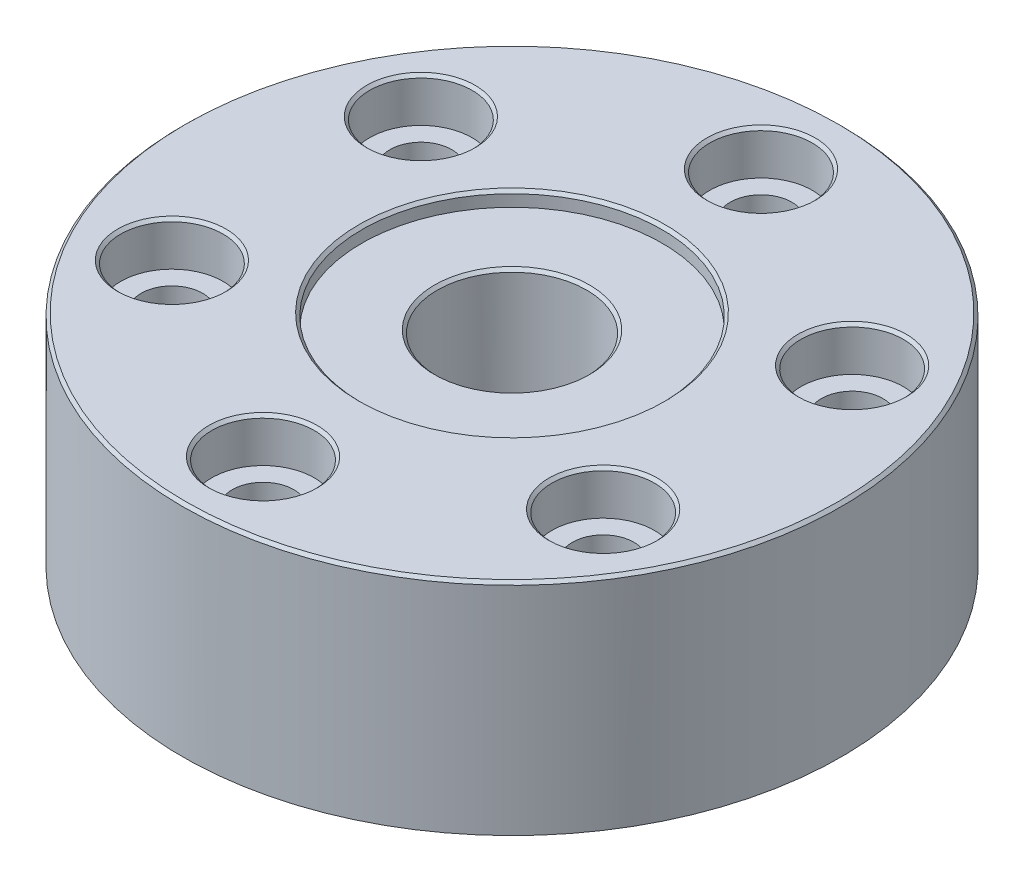
ISO-10303-21;
HEADER;
FILE_DESCRIPTION(('STEP AP214'),'2;1');
FILE_NAME('part.step','',(''),(''),'','','');
FILE_SCHEMA(('AUTOMOTIVE_DESIGN { 1 0 10303 214 1 1 1 1 }'));
ENDSEC;
DATA;
#1=APPLICATION_CONTEXT('core data for automotive mechanical design processes');
#2=APPLICATION_PROTOCOL_DEFINITION('international standard','automotive_design',2000,#1);
#3=PRODUCT_CONTEXT('',#1,'mechanical');
#4=PRODUCT('Part','Part','',(#3));
#5=PRODUCT_RELATED_PRODUCT_CATEGORY('part','',(#4));
#6=PRODUCT_DEFINITION_FORMATION('','',#4);
#7=PRODUCT_DEFINITION_CONTEXT('part definition',#1,'design');
#8=PRODUCT_DEFINITION('design','',#6,#7);
#9=PRODUCT_DEFINITION_SHAPE('','',#8);
#10=(LENGTH_UNIT() NAMED_UNIT(*) SI_UNIT(.MILLI.,.METRE.));
#11=(NAMED_UNIT(*) PLANE_ANGLE_UNIT() SI_UNIT($,.RADIAN.));
#12=(NAMED_UNIT(*) SI_UNIT($,.STERADIAN.) SOLID_ANGLE_UNIT());
#13=UNCERTAINTY_MEASURE_WITH_UNIT(LENGTH_MEASURE(1.E-05),#10,'distance_accuracy_value','');
#14=(GEOMETRIC_REPRESENTATION_CONTEXT(3) GLOBAL_UNCERTAINTY_ASSIGNED_CONTEXT((#13)) GLOBAL_UNIT_ASSIGNED_CONTEXT((#10,
#11,#12)) REPRESENTATION_CONTEXT('',''));
#15=CARTESIAN_POINT('',(0.,0.,0.));
#16=DIRECTION('',(0.,0.,1.));
#17=DIRECTION('',(1.,0.,0.));
#18=AXIS2_PLACEMENT_3D('',#15,#16,#17);
#19=CARTESIAN_POINT('',(0.,15.,0.));
#20=DIRECTION('',(0.,-1.,0.));
#21=DIRECTION('',(0.,0.,-1.));
#22=AXIS2_PLACEMENT_3D('',#19,#20,#21);
#23=CYLINDRICAL_SURFACE('',#22,22.5);
#24=CARTESIAN_POINT('',(0.,14.8,0.));
#25=DIRECTION('',(0.,1.,0.));
#26=DIRECTION('',(0.,0.,1.));
#27=AXIS2_PLACEMENT_3D('',#24,#25,#26);
#28=CIRCLE('',#27,22.5);
#29=CARTESIAN_POINT('',(0.,14.8,22.5));
#30=VERTEX_POINT('',#29);
#31=EDGE_CURVE('E10',#30,#30,#28,.F.);
#32=ORIENTED_EDGE('',*,*,#31,.T.);
#33=EDGE_LOOP('',(#32));
#34=FACE_BOUND('',#33,.T.);
#35=CARTESIAN_POINT('',(0.,0.,0.));
#36=DIRECTION('',(0.,-1.,0.));
#37=DIRECTION('',(0.,0.,-1.));
#38=AXIS2_PLACEMENT_3D('',#35,#36,#37);
#39=CIRCLE('',#38,22.5);
#40=CARTESIAN_POINT('',(0.,0.,-22.5));
#41=VERTEX_POINT('',#40);
#42=EDGE_CURVE('E127',#41,#41,#39,.T.);
#43=ORIENTED_EDGE('',*,*,#42,.F.);
#44=EDGE_LOOP('',(#43));
#45=FACE_BOUND('',#44,.T.);
#46=ADVANCED_FACE('F43',(#34,#45),#23,.T.);
#47=CARTESIAN_POINT('',(22.5,15.,0.));
#48=DIRECTION('',(0.,1.,0.));
#49=DIRECTION('',(0.,0.,1.));
#50=AXIS2_PLACEMENT_3D('',#47,#48,#49);
#51=PLANE('',#50);
#52=CARTESIAN_POINT('',(0.,15.,0.));
#53=DIRECTION('',(0.,1.,0.));
#54=DIRECTION('',(0.,0.,1.));
#55=AXIS2_PLACEMENT_3D('',#52,#53,#54);
#56=CIRCLE('',#55,10.45);
#57=CARTESIAN_POINT('',(0.,15.,10.4500000000001));
#58=VERTEX_POINT('',#57);
#59=EDGE_CURVE('E84',#58,#58,#56,.F.);
#60=ORIENTED_EDGE('',*,*,#59,.T.);
#61=EDGE_LOOP('',(#60));
#62=FACE_BOUND('',#61,.T.);
#63=CARTESIAN_POINT('',(14.7224318643355,15.,8.5));
#64=DIRECTION('',(0.,1.,0.));
#65=DIRECTION('',(0.,0.,1.));
#66=AXIS2_PLACEMENT_3D('',#63,#64,#65);
#67=CIRCLE('',#66,3.70000000000002);
#68=CARTESIAN_POINT('',(14.7224318643355,15.,12.2));
#69=VERTEX_POINT('',#68);
#70=EDGE_CURVE('E88',#69,#69,#67,.F.);
#71=ORIENTED_EDGE('',*,*,#70,.T.);
#72=EDGE_LOOP('',(#71));
#73=FACE_BOUND('',#72,.T.);
#74=CARTESIAN_POINT('',(0.,15.,17.));
#75=DIRECTION('',(0.,1.,0.));
#76=DIRECTION('',(0.,0.,1.));
#77=AXIS2_PLACEMENT_3D('',#74,#75,#76);
#78=CIRCLE('',#77,3.70000000000002);
#79=CARTESIAN_POINT('',(0.,15.,20.7));
#80=VERTEX_POINT('',#79);
#81=EDGE_CURVE('E91',#80,#80,#78,.F.);
#82=ORIENTED_EDGE('',*,*,#81,.T.);
#83=EDGE_LOOP('',(#82));
#84=FACE_BOUND('',#83,.T.);
#85=CARTESIAN_POINT('',(-14.7224318643355,15.,8.5));
#86=DIRECTION('',(0.,1.,0.));
#87=DIRECTION('',(0.,0.,1.));
#88=AXIS2_PLACEMENT_3D('',#85,#86,#87);
#89=CIRCLE('',#88,3.7);
#90=CARTESIAN_POINT('',(-14.7224318643355,15.,12.2));
#91=VERTEX_POINT('',#90);
#92=EDGE_CURVE('E95',#91,#91,#89,.F.);
#93=ORIENTED_EDGE('',*,*,#92,.T.);
#94=EDGE_LOOP('',(#93));
#95=FACE_BOUND('',#94,.T.);
#96=CARTESIAN_POINT('',(14.7224318643355,15.,-8.5));
#97=DIRECTION('',(0.,1.,0.));
#98=DIRECTION('',(0.,0.,1.));
#99=AXIS2_PLACEMENT_3D('',#96,#97,#98);
#100=CIRCLE('',#99,3.70000000000002);
#101=CARTESIAN_POINT('',(14.7224318643355,15.,-4.79999999999998));
#102=VERTEX_POINT('',#101);
#103=EDGE_CURVE('E99',#102,#102,#100,.F.);
#104=ORIENTED_EDGE('',*,*,#103,.T.);
#105=EDGE_LOOP('',(#104));
#106=FACE_BOUND('',#105,.T.);
#107=CARTESIAN_POINT('',(0.,15.,-17.));
#108=DIRECTION('',(0.,1.,0.));
#109=DIRECTION('',(0.,0.,1.));
#110=AXIS2_PLACEMENT_3D('',#107,#108,#109);
#111=CIRCLE('',#110,3.70000000000002);
#112=CARTESIAN_POINT('',(0.,15.,-13.3));
#113=VERTEX_POINT('',#112);
#114=EDGE_CURVE('E103',#113,#113,#111,.F.);
#115=ORIENTED_EDGE('',*,*,#114,.T.);
#116=EDGE_LOOP('',(#115));
#117=FACE_BOUND('',#116,.T.);
#118=CARTESIAN_POINT('',(-14.7224318643355,15.,-8.5));
#119=DIRECTION('',(0.,1.,0.));
#120=DIRECTION('',(0.,0.,1.));
#121=AXIS2_PLACEMENT_3D('',#118,#119,#120);
#122=CIRCLE('',#121,3.7);
#123=CARTESIAN_POINT('',(-14.7224318643355,15.,-4.8));
#124=VERTEX_POINT('',#123);
#125=EDGE_CURVE('E107',#124,#124,#122,.F.);
#126=ORIENTED_EDGE('',*,*,#125,.T.);
#127=EDGE_LOOP('',(#126));
#128=FACE_BOUND('',#127,.T.);
#129=CARTESIAN_POINT('',(0.,15.,0.));
#130=DIRECTION('',(0.,1.,0.));
#131=DIRECTION('',(0.,0.,1.));
#132=AXIS2_PLACEMENT_3D('',#129,#130,#131);
#133=CIRCLE('',#132,22.3);
#134=CARTESIAN_POINT('',(0.,15.,22.3));
#135=VERTEX_POINT('',#134);
#136=EDGE_CURVE('E111',#135,#135,#133,.T.);
#137=ORIENTED_EDGE('',*,*,#136,.T.);
#138=EDGE_LOOP('',(#137));
#139=FACE_BOUND('',#138,.T.);
#140=ADVANCED_FACE('F226',(#62,#73,#84,#95,#106,#117,#128,#139),#51,.T.);
#141=CARTESIAN_POINT('',(0.,0.,0.));
#142=DIRECTION('',(0.,-1.,0.));
#143=DIRECTION('',(0.,0.,-1.));
#144=AXIS2_PLACEMENT_3D('',#141,#142,#143);
#145=PLANE('',#144);
#146=CARTESIAN_POINT('',(0.,0.,0.));
#147=DIRECTION('',(0.,1.,0.));
#148=DIRECTION('',(0.,0.,1.));
#149=AXIS2_PLACEMENT_3D('',#146,#147,#148);
#150=CIRCLE('',#149,5.10000000000001);
#151=CARTESIAN_POINT('',(0.,0.,5.10000000000007));
#152=VERTEX_POINT('',#151);
#153=EDGE_CURVE('E201',#152,#152,#150,.T.);
#154=ORIENTED_EDGE('',*,*,#153,.T.);
#155=EDGE_LOOP('',(#154));
#156=FACE_BOUND('',#155,.T.);
#157=CARTESIAN_POINT('',(14.7224318643355,0.,-8.5));
#158=DIRECTION('',(0.,1.,0.));
#159=DIRECTION('',(0.,0.,1.));
#160=AXIS2_PLACEMENT_3D('',#157,#158,#159);
#161=CIRCLE('',#160,2.1);
#162=CARTESIAN_POINT('',(14.7224318643355,0.,-6.4));
#163=VERTEX_POINT('',#162);
#164=EDGE_CURVE('E189',#163,#163,#161,.T.);
#165=ORIENTED_EDGE('',*,*,#164,.T.);
#166=EDGE_LOOP('',(#165));
#167=FACE_BOUND('',#166,.T.);
#168=CARTESIAN_POINT('',(14.7224318643355,0.,8.5));
#169=DIRECTION('',(0.,1.,0.));
#170=DIRECTION('',(0.,0.,1.));
#171=AXIS2_PLACEMENT_3D('',#168,#169,#170);
#172=CIRCLE('',#171,2.1);
#173=CARTESIAN_POINT('',(14.7224318643355,0.,10.6));
#174=VERTEX_POINT('',#173);
#175=EDGE_CURVE('E177',#174,#174,#172,.T.);
#176=ORIENTED_EDGE('',*,*,#175,.T.);
#177=EDGE_LOOP('',(#176));
#178=FACE_BOUND('',#177,.T.);
#179=CARTESIAN_POINT('',(0.,0.,17.));
#180=DIRECTION('',(0.,1.,0.));
#181=DIRECTION('',(0.,0.,1.));
#182=AXIS2_PLACEMENT_3D('',#179,#180,#181);
#183=CIRCLE('',#182,2.1);
#184=CARTESIAN_POINT('',(0.,0.,19.1));
#185=VERTEX_POINT('',#184);
#186=EDGE_CURVE('E166',#185,#185,#183,.T.);
#187=ORIENTED_EDGE('',*,*,#186,.T.);
#188=EDGE_LOOP('',(#187));
#189=FACE_BOUND('',#188,.T.);
#190=CARTESIAN_POINT('',(-14.7224318643355,0.,8.5));
#191=DIRECTION('',(0.,1.,0.));
#192=DIRECTION('',(0.,0.,1.));
#193=AXIS2_PLACEMENT_3D('',#190,#191,#192);
#194=CIRCLE('',#193,2.1);
#195=CARTESIAN_POINT('',(-14.7224318643355,0.,10.6));
#196=VERTEX_POINT('',#195);
#197=EDGE_CURVE('E154',#196,#196,#194,.T.);
#198=ORIENTED_EDGE('',*,*,#197,.T.);
#199=EDGE_LOOP('',(#198));
#200=FACE_BOUND('',#199,.T.);
#201=CARTESIAN_POINT('',(-14.7224318643355,0.,-8.5));
#202=DIRECTION('',(0.,1.,0.));
#203=DIRECTION('',(0.,0.,1.));
#204=AXIS2_PLACEMENT_3D('',#201,#202,#203);
#205=CIRCLE('',#204,2.1);
#206=CARTESIAN_POINT('',(-14.7224318643355,0.,-6.4));
#207=VERTEX_POINT('',#206);
#208=EDGE_CURVE('E142',#207,#207,#205,.T.);
#209=ORIENTED_EDGE('',*,*,#208,.T.);
#210=EDGE_LOOP('',(#209));
#211=FACE_BOUND('',#210,.T.);
#212=CARTESIAN_POINT('',(0.,0.,-17.));
#213=DIRECTION('',(0.,1.,0.));
#214=DIRECTION('',(0.,0.,1.));
#215=AXIS2_PLACEMENT_3D('',#212,#213,#214);
#216=CIRCLE('',#215,2.1);
#217=CARTESIAN_POINT('',(0.,0.,-14.9));
#218=VERTEX_POINT('',#217);
#219=EDGE_CURVE('E131',#218,#218,#216,.T.);
#220=ORIENTED_EDGE('',*,*,#219,.T.);
#221=EDGE_LOOP('',(#220));
#222=FACE_BOUND('',#221,.T.);
#223=ORIENTED_EDGE('',*,*,#42,.T.);
#224=EDGE_LOOP('',(#223));
#225=FACE_BOUND('',#224,.T.);
#226=ADVANCED_FACE('F230',(#156,#167,#178,#189,#200,#211,#222,#225),#145,.T.);
#227=CARTESIAN_POINT('',(0.,15.,-17.));
#228=DIRECTION('',(0.,1.,0.));
#229=DIRECTION('',(0.,0.,1.));
#230=AXIS2_PLACEMENT_3D('',#227,#228,#229);
#231=CYLINDRICAL_SURFACE('',#230,2.1);
#232=ORIENTED_EDGE('',*,*,#219,.F.);
#233=EDGE_LOOP('',(#232));
#234=FACE_BOUND('',#233,.T.);
#235=CARTESIAN_POINT('',(0.,12.,-17.));
#236=DIRECTION('',(0.,1.,0.));
#237=DIRECTION('',(0.,0.,1.));
#238=AXIS2_PLACEMENT_3D('',#235,#236,#237);
#239=CIRCLE('',#238,2.10000000000001);
#240=CARTESIAN_POINT('',(0.,12.,-14.9));
#241=VERTEX_POINT('',#240);
#242=EDGE_CURVE('E135',#241,#241,#239,.T.);
#243=ORIENTED_EDGE('',*,*,#242,.T.);
#244=EDGE_LOOP('',(#243));
#245=FACE_BOUND('',#244,.T.);
#246=ADVANCED_FACE('F475',(#234,#245),#231,.F.);
#247=CARTESIAN_POINT('',(2.10000000000001,12.,-17.));
#248=DIRECTION('',(0.,-1.,0.));
#249=DIRECTION('',(0.,0.,-1.));
#250=AXIS2_PLACEMENT_3D('',#247,#248,#249);
#251=PLANE('',#250);
#252=ORIENTED_EDGE('',*,*,#242,.F.);
#253=EDGE_LOOP('',(#252));
#254=FACE_BOUND('',#253,.T.);
#255=CARTESIAN_POINT('',(0.,12.,-17.));
#256=DIRECTION('',(0.,1.,0.));
#257=DIRECTION('',(0.,0.,1.));
#258=AXIS2_PLACEMENT_3D('',#255,#256,#257);
#259=CIRCLE('',#258,3.5);
#260=CARTESIAN_POINT('',(0.,12.,-13.5));
#261=VERTEX_POINT('',#260);
#262=EDGE_CURVE('E138',#261,#261,#259,.T.);
#263=ORIENTED_EDGE('',*,*,#262,.T.);
#264=EDGE_LOOP('',(#263));
#265=FACE_BOUND('',#264,.T.);
#266=ADVANCED_FACE('F450',(#254,#265),#251,.F.);
#267=CARTESIAN_POINT('',(0.,15.,-17.));
#268=DIRECTION('',(0.,1.,0.));
#269=DIRECTION('',(0.,0.,1.));
#270=AXIS2_PLACEMENT_3D('',#267,#268,#269);
#271=CYLINDRICAL_SURFACE('',#270,3.5);
#272=CARTESIAN_POINT('',(0.,14.8,-17.));
#273=DIRECTION('',(0.,1.,0.));
#274=DIRECTION('',(0.,0.,1.));
#275=AXIS2_PLACEMENT_3D('',#272,#273,#274);
#276=CIRCLE('',#275,3.5);
#277=CARTESIAN_POINT('',(0.,14.8,-13.5));
#278=VERTEX_POINT('',#277);
#279=EDGE_CURVE('E59',#278,#278,#276,.T.);
#280=ORIENTED_EDGE('',*,*,#279,.T.);
#281=EDGE_LOOP('',(#280));
#282=FACE_BOUND('',#281,.T.);
#283=ORIENTED_EDGE('',*,*,#262,.F.);
#284=EDGE_LOOP('',(#283));
#285=FACE_BOUND('',#284,.T.);
#286=ADVANCED_FACE('F444',(#282,#285),#271,.F.);
#287=CARTESIAN_POINT('',(-14.7224318643355,15.,-8.5));
#288=DIRECTION('',(0.,1.,0.));
#289=DIRECTION('',(0.,0.,1.));
#290=AXIS2_PLACEMENT_3D('',#287,#288,#289);
#291=CYLINDRICAL_SURFACE('',#290,2.1);
#292=ORIENTED_EDGE('',*,*,#208,.F.);
#293=EDGE_LOOP('',(#292));
#294=FACE_BOUND('',#293,.T.);
#295=CARTESIAN_POINT('',(-14.7224318643355,12.,-8.5));
#296=DIRECTION('',(0.,1.,0.));
#297=DIRECTION('',(0.,0.,1.));
#298=AXIS2_PLACEMENT_3D('',#295,#296,#297);
#299=CIRCLE('',#298,2.10000000000001);
#300=CARTESIAN_POINT('',(-14.7224318643355,12.,-6.39999999999999));
#301=VERTEX_POINT('',#300);
#302=EDGE_CURVE('E146',#301,#301,#299,.T.);
#303=ORIENTED_EDGE('',*,*,#302,.T.);
#304=EDGE_LOOP('',(#303));
#305=FACE_BOUND('',#304,.T.);
#306=ADVANCED_FACE('F449',(#294,#305),#291,.F.);
#307=CARTESIAN_POINT('',(-12.6224318643354,12.,-8.5));
#308=DIRECTION('',(0.,-1.,0.));
#309=DIRECTION('',(0.,0.,-1.));
#310=AXIS2_PLACEMENT_3D('',#307,#308,#309);
#311=PLANE('',#310);
#312=ORIENTED_EDGE('',*,*,#302,.F.);
#313=EDGE_LOOP('',(#312));
#314=FACE_BOUND('',#313,.T.);
#315=CARTESIAN_POINT('',(-14.7224318643355,12.,-8.5));
#316=DIRECTION('',(0.,1.,0.));
#317=DIRECTION('',(0.,0.,1.));
#318=AXIS2_PLACEMENT_3D('',#315,#316,#317);
#319=CIRCLE('',#318,3.5);
#320=CARTESIAN_POINT('',(-14.7224318643355,12.,-5.));
#321=VERTEX_POINT('',#320);
#322=EDGE_CURVE('E150',#321,#321,#319,.T.);
#323=ORIENTED_EDGE('',*,*,#322,.T.);
#324=EDGE_LOOP('',(#323));
#325=FACE_BOUND('',#324,.T.);
#326=ADVANCED_FACE('F435',(#314,#325),#311,.F.);
#327=CARTESIAN_POINT('',(-14.7224318643355,15.,-8.5));
#328=DIRECTION('',(0.,1.,0.));
#329=DIRECTION('',(0.,0.,1.));
#330=AXIS2_PLACEMENT_3D('',#327,#328,#329);
#331=CYLINDRICAL_SURFACE('',#330,3.5);
#332=CARTESIAN_POINT('',(-14.7224318643355,14.8,-8.5));
#333=DIRECTION('',(0.,1.,0.));
#334=DIRECTION('',(0.,0.,1.));
#335=AXIS2_PLACEMENT_3D('',#332,#333,#334);
#336=CIRCLE('',#335,3.5);
#337=CARTESIAN_POINT('',(-14.7224318643355,14.8,-5.));
#338=VERTEX_POINT('',#337);
#339=EDGE_CURVE('E52',#338,#338,#336,.T.);
#340=ORIENTED_EDGE('',*,*,#339,.T.);
#341=EDGE_LOOP('',(#340));
#342=FACE_BOUND('',#341,.T.);
#343=ORIENTED_EDGE('',*,*,#322,.F.);
#344=EDGE_LOOP('',(#343));
#345=FACE_BOUND('',#344,.T.);
#346=ADVANCED_FACE('F429',(#342,#345),#331,.F.);
#347=CARTESIAN_POINT('',(-14.7224318643355,15.,8.5));
#348=DIRECTION('',(0.,1.,0.));
#349=DIRECTION('',(0.,0.,1.));
#350=AXIS2_PLACEMENT_3D('',#347,#348,#349);
#351=CYLINDRICAL_SURFACE('',#350,2.1);
#352=ORIENTED_EDGE('',*,*,#197,.F.);
#353=EDGE_LOOP('',(#352));
#354=FACE_BOUND('',#353,.T.);
#355=CARTESIAN_POINT('',(-14.7224318643355,12.,8.5));
#356=DIRECTION('',(0.,1.,0.));
#357=DIRECTION('',(0.,0.,1.));
#358=AXIS2_PLACEMENT_3D('',#355,#356,#357);
#359=CIRCLE('',#358,2.10000000000001);
#360=CARTESIAN_POINT('',(-14.7224318643355,12.,10.6));
#361=VERTEX_POINT('',#360);
#362=EDGE_CURVE('E158',#361,#361,#359,.T.);
#363=ORIENTED_EDGE('',*,*,#362,.T.);
#364=EDGE_LOOP('',(#363));
#365=FACE_BOUND('',#364,.T.);
#366=ADVANCED_FACE('F434',(#354,#365),#351,.F.);
#367=CARTESIAN_POINT('',(-12.6224318643354,12.,8.5));
#368=DIRECTION('',(0.,-1.,0.));
#369=DIRECTION('',(0.,0.,-1.));
#370=AXIS2_PLACEMENT_3D('',#367,#368,#369);
#371=PLANE('',#370);
#372=ORIENTED_EDGE('',*,*,#362,.F.);
#373=EDGE_LOOP('',(#372));
#374=FACE_BOUND('',#373,.T.);
#375=CARTESIAN_POINT('',(-14.7224318643355,12.,8.5));
#376=DIRECTION('',(0.,1.,0.));
#377=DIRECTION('',(0.,0.,1.));
#378=AXIS2_PLACEMENT_3D('',#375,#376,#377);
#379=CIRCLE('',#378,3.5);
#380=CARTESIAN_POINT('',(-14.7224318643355,12.,12.));
#381=VERTEX_POINT('',#380);
#382=EDGE_CURVE('E162',#381,#381,#379,.T.);
#383=ORIENTED_EDGE('',*,*,#382,.T.);
#384=EDGE_LOOP('',(#383));
#385=FACE_BOUND('',#384,.T.);
#386=ADVANCED_FACE('F419',(#374,#385),#371,.F.);
#387=CARTESIAN_POINT('',(-14.7224318643355,15.,8.5));
#388=DIRECTION('',(0.,1.,0.));
#389=DIRECTION('',(0.,0.,1.));
#390=AXIS2_PLACEMENT_3D('',#387,#388,#389);
#391=CYLINDRICAL_SURFACE('',#390,3.5);
#392=CARTESIAN_POINT('',(-14.7224318643355,14.8,8.5));
#393=DIRECTION('',(0.,1.,0.));
#394=DIRECTION('',(0.,0.,1.));
#395=AXIS2_PLACEMENT_3D('',#392,#393,#394);
#396=CIRCLE('',#395,3.5);
#397=CARTESIAN_POINT('',(-14.7224318643355,14.8,12.));
#398=VERTEX_POINT('',#397);
#399=EDGE_CURVE('E72',#398,#398,#396,.T.);
#400=ORIENTED_EDGE('',*,*,#399,.T.);
#401=EDGE_LOOP('',(#400));
#402=FACE_BOUND('',#401,.T.);
#403=ORIENTED_EDGE('',*,*,#382,.F.);
#404=EDGE_LOOP('',(#403));
#405=FACE_BOUND('',#404,.T.);
#406=ADVANCED_FACE('F413',(#402,#405),#391,.F.);
#407=CARTESIAN_POINT('',(0.,15.,17.));
#408=DIRECTION('',(0.,1.,0.));
#409=DIRECTION('',(0.,0.,1.));
#410=AXIS2_PLACEMENT_3D('',#407,#408,#409);
#411=CYLINDRICAL_SURFACE('',#410,2.1);
#412=ORIENTED_EDGE('',*,*,#186,.F.);
#413=EDGE_LOOP('',(#412));
#414=FACE_BOUND('',#413,.T.);
#415=CARTESIAN_POINT('',(0.,12.,17.));
#416=DIRECTION('',(0.,1.,0.));
#417=DIRECTION('',(0.,0.,1.));
#418=AXIS2_PLACEMENT_3D('',#415,#416,#417);
#419=CIRCLE('',#418,2.10000000000001);
#420=CARTESIAN_POINT('',(0.,12.,19.1));
#421=VERTEX_POINT('',#420);
#422=EDGE_CURVE('E170',#421,#421,#419,.T.);
#423=ORIENTED_EDGE('',*,*,#422,.T.);
#424=EDGE_LOOP('',(#423));
#425=FACE_BOUND('',#424,.T.);
#426=ADVANCED_FACE('F418',(#414,#425),#411,.F.);
#427=CARTESIAN_POINT('',(2.10000000000001,12.,17.));
#428=DIRECTION('',(0.,-1.,0.));
#429=DIRECTION('',(0.,0.,-1.));
#430=AXIS2_PLACEMENT_3D('',#427,#428,#429);
#431=PLANE('',#430);
#432=ORIENTED_EDGE('',*,*,#422,.F.);
#433=EDGE_LOOP('',(#432));
#434=FACE_BOUND('',#433,.T.);
#435=CARTESIAN_POINT('',(0.,12.,17.));
#436=DIRECTION('',(0.,1.,0.));
#437=DIRECTION('',(0.,0.,1.));
#438=AXIS2_PLACEMENT_3D('',#435,#436,#437);
#439=CIRCLE('',#438,3.5);
#440=CARTESIAN_POINT('',(0.,12.,20.5));
#441=VERTEX_POINT('',#440);
#442=EDGE_CURVE('E174',#441,#441,#439,.T.);
#443=ORIENTED_EDGE('',*,*,#442,.T.);
#444=EDGE_LOOP('',(#443));
#445=FACE_BOUND('',#444,.T.);
#446=ADVANCED_FACE('F403',(#434,#445),#431,.F.);
#447=CARTESIAN_POINT('',(0.,15.,17.));
#448=DIRECTION('',(0.,1.,0.));
#449=DIRECTION('',(0.,0.,1.));
#450=AXIS2_PLACEMENT_3D('',#447,#448,#449);
#451=CYLINDRICAL_SURFACE('',#450,3.5);
#452=CARTESIAN_POINT('',(0.,14.8,17.));
#453=DIRECTION('',(0.,1.,0.));
#454=DIRECTION('',(0.,0.,1.));
#455=AXIS2_PLACEMENT_3D('',#452,#453,#454);
#456=CIRCLE('',#455,3.5);
#457=CARTESIAN_POINT('',(0.,14.8,20.5));
#458=VERTEX_POINT('',#457);
#459=EDGE_CURVE('E76',#458,#458,#456,.T.);
#460=ORIENTED_EDGE('',*,*,#459,.T.);
#461=EDGE_LOOP('',(#460));
#462=FACE_BOUND('',#461,.T.);
#463=ORIENTED_EDGE('',*,*,#442,.F.);
#464=EDGE_LOOP('',(#463));
#465=FACE_BOUND('',#464,.T.);
#466=ADVANCED_FACE('F397',(#462,#465),#451,.F.);
#467=CARTESIAN_POINT('',(14.7224318643355,15.,8.5));
#468=DIRECTION('',(0.,1.,0.));
#469=DIRECTION('',(0.,0.,1.));
#470=AXIS2_PLACEMENT_3D('',#467,#468,#469);
#471=CYLINDRICAL_SURFACE('',#470,2.1);
#472=ORIENTED_EDGE('',*,*,#175,.F.);
#473=EDGE_LOOP('',(#472));
#474=FACE_BOUND('',#473,.T.);
#475=CARTESIAN_POINT('',(14.7224318643355,12.,8.5));
#476=DIRECTION('',(0.,1.,0.));
#477=DIRECTION('',(0.,0.,1.));
#478=AXIS2_PLACEMENT_3D('',#475,#476,#477);
#479=CIRCLE('',#478,2.10000000000001);
#480=CARTESIAN_POINT('',(14.7224318643355,12.,10.6));
#481=VERTEX_POINT('',#480);
#482=EDGE_CURVE('E181',#481,#481,#479,.T.);
#483=ORIENTED_EDGE('',*,*,#482,.T.);
#484=EDGE_LOOP('',(#483));
#485=FACE_BOUND('',#484,.T.);
#486=ADVANCED_FACE('F402',(#474,#485),#471,.F.);
#487=CARTESIAN_POINT('',(16.8224318643355,12.,8.5));
#488=DIRECTION('',(0.,-1.,0.));
#489=DIRECTION('',(0.,0.,-1.));
#490=AXIS2_PLACEMENT_3D('',#487,#488,#489);
#491=PLANE('',#490);
#492=ORIENTED_EDGE('',*,*,#482,.F.);
#493=EDGE_LOOP('',(#492));
#494=FACE_BOUND('',#493,.T.);
#495=CARTESIAN_POINT('',(14.7224318643355,12.,8.5));
#496=DIRECTION('',(0.,1.,0.));
#497=DIRECTION('',(0.,0.,1.));
#498=AXIS2_PLACEMENT_3D('',#495,#496,#497);
#499=CIRCLE('',#498,3.5);
#500=CARTESIAN_POINT('',(14.7224318643355,12.,12.));
#501=VERTEX_POINT('',#500);
#502=EDGE_CURVE('E185',#501,#501,#499,.T.);
#503=ORIENTED_EDGE('',*,*,#502,.T.);
#504=EDGE_LOOP('',(#503));
#505=FACE_BOUND('',#504,.T.);
#506=ADVANCED_FACE('F387',(#494,#505),#491,.F.);
#507=CARTESIAN_POINT('',(14.7224318643355,15.,8.5));
#508=DIRECTION('',(0.,1.,0.));
#509=DIRECTION('',(0.,0.,1.));
#510=AXIS2_PLACEMENT_3D('',#507,#508,#509);
#511=CYLINDRICAL_SURFACE('',#510,3.5);
#512=CARTESIAN_POINT('',(14.7224318643355,14.8,8.5));
#513=DIRECTION('',(0.,1.,0.));
#514=DIRECTION('',(0.,0.,1.));
#515=AXIS2_PLACEMENT_3D('',#512,#513,#514);
#516=CIRCLE('',#515,3.5);
#517=CARTESIAN_POINT('',(14.7224318643355,14.8,12.));
#518=VERTEX_POINT('',#517);
#519=EDGE_CURVE('E80',#518,#518,#516,.T.);
#520=ORIENTED_EDGE('',*,*,#519,.T.);
#521=EDGE_LOOP('',(#520));
#522=FACE_BOUND('',#521,.T.);
#523=ORIENTED_EDGE('',*,*,#502,.F.);
#524=EDGE_LOOP('',(#523));
#525=FACE_BOUND('',#524,.T.);
#526=ADVANCED_FACE('F381',(#522,#525),#511,.F.);
#527=CARTESIAN_POINT('',(14.7224318643355,15.,-8.5));
#528=DIRECTION('',(0.,1.,0.));
#529=DIRECTION('',(0.,0.,1.));
#530=AXIS2_PLACEMENT_3D('',#527,#528,#529);
#531=CYLINDRICAL_SURFACE('',#530,2.1);
#532=ORIENTED_EDGE('',*,*,#164,.F.);
#533=EDGE_LOOP('',(#532));
#534=FACE_BOUND('',#533,.T.);
#535=CARTESIAN_POINT('',(14.7224318643355,12.,-8.5));
#536=DIRECTION('',(0.,1.,0.));
#537=DIRECTION('',(0.,0.,1.));
#538=AXIS2_PLACEMENT_3D('',#535,#536,#537);
#539=CIRCLE('',#538,2.10000000000001);
#540=CARTESIAN_POINT('',(14.7224318643355,12.,-6.39999999999999));
#541=VERTEX_POINT('',#540);
#542=EDGE_CURVE('E193',#541,#541,#539,.T.);
#543=ORIENTED_EDGE('',*,*,#542,.T.);
#544=EDGE_LOOP('',(#543));
#545=FACE_BOUND('',#544,.T.);
#546=ADVANCED_FACE('F386',(#534,#545),#531,.F.);
#547=CARTESIAN_POINT('',(16.8224318643355,12.,-8.5));
#548=DIRECTION('',(0.,-1.,0.));
#549=DIRECTION('',(0.,0.,-1.));
#550=AXIS2_PLACEMENT_3D('',#547,#548,#549);
#551=PLANE('',#550);
#552=ORIENTED_EDGE('',*,*,#542,.F.);
#553=EDGE_LOOP('',(#552));
#554=FACE_BOUND('',#553,.T.);
#555=CARTESIAN_POINT('',(14.7224318643355,12.,-8.5));
#556=DIRECTION('',(0.,1.,0.));
#557=DIRECTION('',(0.,0.,1.));
#558=AXIS2_PLACEMENT_3D('',#555,#556,#557);
#559=CIRCLE('',#558,3.5);
#560=CARTESIAN_POINT('',(14.7224318643355,12.,-5.));
#561=VERTEX_POINT('',#560);
#562=EDGE_CURVE('E197',#561,#561,#559,.T.);
#563=ORIENTED_EDGE('',*,*,#562,.T.);
#564=EDGE_LOOP('',(#563));
#565=FACE_BOUND('',#564,.T.);
#566=ADVANCED_FACE('F373',(#554,#565),#551,.F.);
#567=CARTESIAN_POINT('',(14.7224318643355,15.,-8.5));
#568=DIRECTION('',(0.,1.,0.));
#569=DIRECTION('',(0.,0.,1.));
#570=AXIS2_PLACEMENT_3D('',#567,#568,#569);
#571=CYLINDRICAL_SURFACE('',#570,3.5);
#572=CARTESIAN_POINT('',(14.7224318643355,14.8,-8.5));
#573=DIRECTION('',(0.,1.,0.));
#574=DIRECTION('',(0.,0.,1.));
#575=AXIS2_PLACEMENT_3D('',#572,#573,#574);
#576=CIRCLE('',#575,3.5);
#577=CARTESIAN_POINT('',(14.7224318643355,14.8,-5.));
#578=VERTEX_POINT('',#577);
#579=EDGE_CURVE('E66',#578,#578,#576,.T.);
#580=ORIENTED_EDGE('',*,*,#579,.T.);
#581=EDGE_LOOP('',(#580));
#582=FACE_BOUND('',#581,.T.);
#583=ORIENTED_EDGE('',*,*,#562,.F.);
#584=EDGE_LOOP('',(#583));
#585=FACE_BOUND('',#584,.T.);
#586=ADVANCED_FACE('F363',(#582,#585),#571,.F.);
#587=CARTESIAN_POINT('',(0.,15.,0.));
#588=DIRECTION('',(0.,1.,0.));
#589=DIRECTION('',(0.,0.,1.));
#590=AXIS2_PLACEMENT_3D('',#587,#588,#589);
#591=CYLINDRICAL_SURFACE('',#590,5.10000000000001);
#592=CARTESIAN_POINT('',(0.,13.8,0.));
#593=DIRECTION('',(0.,-1.,0.));
#594=DIRECTION('',(0.,0.,-1.));
#595=AXIS2_PLACEMENT_3D('',#592,#593,#594);
#596=CIRCLE('',#595,5.10000000000001);
#597=CARTESIAN_POINT('',(0.,13.8,-5.09999999999996));
#598=VERTEX_POINT('',#597);
#599=EDGE_CURVE('E123',#598,#598,#596,.F.);
#600=ORIENTED_EDGE('',*,*,#599,.T.);
#601=EDGE_LOOP('',(#600));
#602=FACE_BOUND('',#601,.T.);
#603=ORIENTED_EDGE('',*,*,#153,.F.);
#604=EDGE_LOOP('',(#603));
#605=FACE_BOUND('',#604,.T.);
#606=ADVANCED_FACE('F222',(#602,#605),#591,.F.);
#607=CARTESIAN_POINT('',(5.09999999999997,14.,0.));
#608=DIRECTION('',(0.,-1.,0.));
#609=DIRECTION('',(0.,0.,-1.));
#610=AXIS2_PLACEMENT_3D('',#607,#608,#609);
#611=PLANE('',#610);
#612=CARTESIAN_POINT('',(0.,14.,0.));
#613=DIRECTION('',(0.,-1.,0.));
#614=DIRECTION('',(0.,0.,-1.));
#615=AXIS2_PLACEMENT_3D('',#612,#613,#614);
#616=CIRCLE('',#615,5.30000000000001);
#617=CARTESIAN_POINT('',(0.,14.,-5.29999999999996));
#618=VERTEX_POINT('',#617);
#619=EDGE_CURVE('E119',#618,#618,#616,.T.);
#620=ORIENTED_EDGE('',*,*,#619,.T.);
#621=EDGE_LOOP('',(#620));
#622=FACE_BOUND('',#621,.T.);
#623=CARTESIAN_POINT('',(0.,14.,0.));
#624=DIRECTION('',(0.,1.,0.));
#625=DIRECTION('',(0.,0.,1.));
#626=AXIS2_PLACEMENT_3D('',#623,#624,#625);
#627=CIRCLE('',#626,10.25);
#628=CARTESIAN_POINT('',(0.,14.,10.2500000000001));
#629=VERTEX_POINT('',#628);
#630=EDGE_CURVE('E205',#629,#629,#627,.T.);
#631=ORIENTED_EDGE('',*,*,#630,.T.);
#632=EDGE_LOOP('',(#631));
#633=FACE_BOUND('',#632,.T.);
#634=ADVANCED_FACE('F209',(#622,#633),#611,.F.);
#635=CARTESIAN_POINT('',(0.,15.,0.));
#636=DIRECTION('',(0.,1.,0.));
#637=DIRECTION('',(0.,0.,1.));
#638=AXIS2_PLACEMENT_3D('',#635,#636,#637);
#639=CYLINDRICAL_SURFACE('',#638,10.25);
#640=CARTESIAN_POINT('',(0.,14.8,0.));
#641=DIRECTION('',(0.,1.,0.));
#642=DIRECTION('',(0.,0.,1.));
#643=AXIS2_PLACEMENT_3D('',#640,#641,#642);
#644=CIRCLE('',#643,10.25);
#645=CARTESIAN_POINT('',(0.,14.8,10.2500000000001));
#646=VERTEX_POINT('',#645);
#647=EDGE_CURVE('E115',#646,#646,#644,.T.);
#648=ORIENTED_EDGE('',*,*,#647,.T.);
#649=EDGE_LOOP('',(#648));
#650=FACE_BOUND('',#649,.T.);
#651=ORIENTED_EDGE('',*,*,#630,.F.);
#652=EDGE_LOOP('',(#651));
#653=FACE_BOUND('',#652,.T.);
#654=ADVANCED_FACE('F211',(#650,#653),#639,.F.);
#655=CARTESIAN_POINT('',(0.,13.8,0.));
#656=DIRECTION('',(0.,1.,0.));
#657=DIRECTION('',(0.,0.,1.));
#658=AXIS2_PLACEMENT_3D('',#655,#656,#657);
#659=CONICAL_SURFACE('',#658,5.10000000000001,0.785398163397453);
#660=ORIENTED_EDGE('',*,*,#619,.F.);
#661=EDGE_LOOP('',(#660));
#662=FACE_BOUND('',#661,.T.);
#663=ORIENTED_EDGE('',*,*,#599,.F.);
#664=EDGE_LOOP('',(#663));
#665=FACE_BOUND('',#664,.T.);
#666=ADVANCED_FACE('F213',(#662,#665),#659,.F.);
#667=CARTESIAN_POINT('',(0.,14.8,0.));
#668=DIRECTION('',(0.,1.,0.));
#669=DIRECTION('',(0.,0.,1.));
#670=AXIS2_PLACEMENT_3D('',#667,#668,#669);
#671=CONICAL_SURFACE('',#670,10.25,0.785398163397448);
#672=ORIENTED_EDGE('',*,*,#59,.F.);
#673=EDGE_LOOP('',(#672));
#674=FACE_BOUND('',#673,.T.);
#675=ORIENTED_EDGE('',*,*,#647,.F.);
#676=EDGE_LOOP('',(#675));
#677=FACE_BOUND('',#676,.T.);
#678=ADVANCED_FACE('F219',(#674,#677),#671,.F.);
#679=CARTESIAN_POINT('',(14.7224318643355,14.8,8.5));
#680=DIRECTION('',(0.,1.,0.));
#681=DIRECTION('',(0.,0.,1.));
#682=AXIS2_PLACEMENT_3D('',#679,#680,#681);
#683=CONICAL_SURFACE('',#682,3.5,0.785398163397461);
#684=ORIENTED_EDGE('',*,*,#70,.F.);
#685=EDGE_LOOP('',(#684));
#686=FACE_BOUND('',#685,.T.);
#687=ORIENTED_EDGE('',*,*,#519,.F.);
#688=EDGE_LOOP('',(#687));
#689=FACE_BOUND('',#688,.T.);
#690=ADVANCED_FACE('F245',(#686,#689),#683,.F.);
#691=CARTESIAN_POINT('',(0.,14.8,17.));
#692=DIRECTION('',(0.,1.,0.));
#693=DIRECTION('',(0.,0.,1.));
#694=AXIS2_PLACEMENT_3D('',#691,#692,#693);
#695=CONICAL_SURFACE('',#694,3.5,0.785398163397461);
#696=CARTESIAN_POINT('',(0.,15.,20.7));
#697=CARTESIAN_POINT('',(0.,14.9979166666667,20.6979166666667));
#698=CARTESIAN_POINT('',(0.,14.9958333333333,20.6958333333333));
#699=CARTESIAN_POINT('',(0.,14.9916666666667,20.6916666666667));
#700=CARTESIAN_POINT('',(0.,14.9895833333333,20.6895833333333));
#701=CARTESIAN_POINT('',(0.,14.9854166666667,20.6854166666667));
#702=CARTESIAN_POINT('',(0.,14.9833333333333,20.6833333333333));
#703=CARTESIAN_POINT('',(0.,14.9791666666667,20.6791666666667));
#704=CARTESIAN_POINT('',(0.,14.9770833333333,20.6770833333333));
#705=CARTESIAN_POINT('',(0.,14.9729166666667,20.6729166666667));
#706=CARTESIAN_POINT('',(0.,14.9708333333333,20.6708333333333));
#707=CARTESIAN_POINT('',(0.,14.9666666666667,20.6666666666667));
#708=CARTESIAN_POINT('',(0.,14.9645833333333,20.6645833333333));
#709=CARTESIAN_POINT('',(0.,14.9604166666667,20.6604166666667));
#710=CARTESIAN_POINT('',(0.,14.9583333333333,20.6583333333333));
#711=CARTESIAN_POINT('',(0.,14.9541666666667,20.6541666666667));
#712=CARTESIAN_POINT('',(0.,14.9520833333333,20.6520833333333));
#713=CARTESIAN_POINT('',(0.,14.9479166666667,20.6479166666667));
#714=CARTESIAN_POINT('',(0.,14.9458333333333,20.6458333333333));
#715=CARTESIAN_POINT('',(0.,14.9416666666667,20.6416666666667));
#716=CARTESIAN_POINT('',(0.,14.9395833333333,20.6395833333333));
#717=CARTESIAN_POINT('',(0.,14.9354166666667,20.6354166666667));
#718=CARTESIAN_POINT('',(0.,14.9333333333333,20.6333333333333));
#719=CARTESIAN_POINT('',(0.,14.9291666666667,20.6291666666667));
#720=CARTESIAN_POINT('',(0.,14.9270833333333,20.6270833333333));
#721=CARTESIAN_POINT('',(0.,14.9229166666667,20.6229166666667));
#722=CARTESIAN_POINT('',(0.,14.9208333333333,20.6208333333333));
#723=CARTESIAN_POINT('',(0.,14.9166666666667,20.6166666666667));
#724=CARTESIAN_POINT('',(0.,14.9145833333333,20.6145833333333));
#725=CARTESIAN_POINT('',(0.,14.9104166666667,20.6104166666667));
#726=CARTESIAN_POINT('',(0.,14.9083333333333,20.6083333333333));
#727=CARTESIAN_POINT('',(0.,14.9041666666667,20.6041666666667));
#728=CARTESIAN_POINT('',(0.,14.9020833333333,20.6020833333333));
#729=CARTESIAN_POINT('',(0.,14.8979166666667,20.5979166666667));
#730=CARTESIAN_POINT('',(0.,14.8958333333333,20.5958333333333));
#731=CARTESIAN_POINT('',(0.,14.8916666666667,20.5916666666667));
#732=CARTESIAN_POINT('',(0.,14.8895833333333,20.5895833333333));
#733=CARTESIAN_POINT('',(0.,14.8854166666667,20.5854166666667));
#734=CARTESIAN_POINT('',(0.,14.8833333333333,20.5833333333333));
#735=CARTESIAN_POINT('',(0.,14.8791666666667,20.5791666666667));
#736=CARTESIAN_POINT('',(0.,14.8770833333333,20.5770833333333));
#737=CARTESIAN_POINT('',(0.,14.8729166666667,20.5729166666667));
#738=CARTESIAN_POINT('',(0.,14.8708333333333,20.5708333333333));
#739=CARTESIAN_POINT('',(0.,14.8666666666667,20.5666666666667));
#740=CARTESIAN_POINT('',(0.,14.8645833333333,20.5645833333333));
#741=CARTESIAN_POINT('',(0.,14.8604166666667,20.5604166666667));
#742=CARTESIAN_POINT('',(0.,14.8583333333333,20.5583333333333));
#743=CARTESIAN_POINT('',(0.,14.8541666666667,20.5541666666667));
#744=CARTESIAN_POINT('',(0.,14.8520833333333,20.5520833333333));
#745=CARTESIAN_POINT('',(0.,14.8479166666667,20.5479166666667));
#746=CARTESIAN_POINT('',(0.,14.8458333333333,20.5458333333333));
#747=CARTESIAN_POINT('',(0.,14.8416666666667,20.5416666666667));
#748=CARTESIAN_POINT('',(0.,14.8395833333333,20.5395833333333));
#749=CARTESIAN_POINT('',(0.,14.8354166666667,20.5354166666667));
#750=CARTESIAN_POINT('',(0.,14.8333333333333,20.5333333333333));
#751=CARTESIAN_POINT('',(0.,14.8291666666667,20.5291666666667));
#752=CARTESIAN_POINT('',(0.,14.8270833333333,20.5270833333333));
#753=CARTESIAN_POINT('',(0.,14.8229166666667,20.5229166666667));
#754=CARTESIAN_POINT('',(0.,14.8208333333333,20.5208333333333));
#755=CARTESIAN_POINT('',(0.,14.8166666666667,20.5166666666667));
#756=CARTESIAN_POINT('',(0.,14.8145833333333,20.5145833333333));
#757=CARTESIAN_POINT('',(0.,14.8104166666667,20.5104166666667));
#758=CARTESIAN_POINT('',(0.,14.8083333333333,20.5083333333333));
#759=CARTESIAN_POINT('',(0.,14.8041666666667,20.5041666666667));
#760=CARTESIAN_POINT('',(0.,14.8020833333333,20.5020833333333));
#761=CARTESIAN_POINT('',(0.,14.8,20.5));
#762=B_SPLINE_CURVE_WITH_KNOTS('',3,(#696,#697,#698,#699,#700,#701,#702,#703,#704,#705,#706,
#707,#708,#709,#710,#711,#712,#713,#714,#715,#716,#717,#718,#719,#720,#721,#722,#723,#724,#725,
#726,#727,#728,#729,#730,#731,#732,#733,#734,#735,#736,#737,#738,#739,#740,#741,#742,#743,#744,
#745,#746,#747,#748,#749,#750,#751,#752,#753,#754,#755,#756,#757,#758,#759,#760,#761),
.UNSPECIFIED.,.F.,.F.,(4,2,2,2,2,2,2,2,2,2,2,2,2,2,2,2,2,2,2,2,2,2,2,2,2,2,2,2,2,2,2,2,4),(0.,
0.00883883476483455,0.0176776695296666,0.0265165042944975,0.0353553390593321,0.0441941738241629,
0.053033008588995,0.0618718433538296,0.0707106781186605,0.0795495128834926,0.0883883476483259,
0.097227182413158,0.10606601717799,0.114904851942823,0.123743686707655,0.132582521472486,
0.141421356237321,0.150260191002153,0.159099025766984,0.167937860531818,0.176776695296649,
0.185615530061484,0.194454364826316,0.203293199591147,0.212132034355979,0.220970869120812,
0.229809703885644,0.238648538650479,0.24748737341531,0.256326208180142,0.265165042944973,
0.274003877709807,0.282842712474638),.UNSPECIFIED.);
#763=EDGE_CURVE('BSEAM252',#80,#458,#762,.T.);
#764=ORIENTED_EDGE('',*,*,#81,.F.);
#765=ORIENTED_EDGE('',*,*,#459,.F.);
#766=ORIENTED_EDGE('',*,*,#763,.T.);
#767=ORIENTED_EDGE('',*,*,#763,.F.);
#768=EDGE_LOOP('',(#764,#766,#765,#767));
#769=FACE_BOUND('',#768,.T.);
#770=ADVANCED_FACE('F252',(#769),#695,.F.);
#771=CARTESIAN_POINT('',(-14.7224318643355,14.8,8.5));
#772=DIRECTION('',(0.,1.,0.));
#773=DIRECTION('',(0.,0.,1.));
#774=AXIS2_PLACEMENT_3D('',#771,#772,#773);
#775=CONICAL_SURFACE('',#774,3.5,0.78539816339744);
#776=ORIENTED_EDGE('',*,*,#92,.F.);
#777=EDGE_LOOP('',(#776));
#778=FACE_BOUND('',#777,.T.);
#779=ORIENTED_EDGE('',*,*,#399,.F.);
#780=EDGE_LOOP('',(#779));
#781=FACE_BOUND('',#780,.T.);
#782=ADVANCED_FACE('F259',(#778,#781),#775,.F.);
#783=CARTESIAN_POINT('',(14.7224318643355,14.8,-8.5));
#784=DIRECTION('',(0.,1.,0.));
#785=DIRECTION('',(0.,0.,1.));
#786=AXIS2_PLACEMENT_3D('',#783,#784,#785);
#787=CONICAL_SURFACE('',#786,3.5,0.785398163397461);
#788=ORIENTED_EDGE('',*,*,#103,.F.);
#789=EDGE_LOOP('',(#788));
#790=FACE_BOUND('',#789,.T.);
#791=ORIENTED_EDGE('',*,*,#579,.F.);
#792=EDGE_LOOP('',(#791));
#793=FACE_BOUND('',#792,.T.);
#794=ADVANCED_FACE('F266',(#790,#793),#787,.F.);
#795=CARTESIAN_POINT('',(0.,14.8,-17.));
#796=DIRECTION('',(0.,1.,0.));
#797=DIRECTION('',(0.,0.,1.));
#798=AXIS2_PLACEMENT_3D('',#795,#796,#797);
#799=CONICAL_SURFACE('',#798,3.5,0.785398163397461);
#800=CARTESIAN_POINT('',(0.,15.,-13.3));
#801=CARTESIAN_POINT('',(0.,14.9979166666667,-13.3020833333333));
#802=CARTESIAN_POINT('',(0.,14.9958333333333,-13.3041666666667));
#803=CARTESIAN_POINT('',(0.,14.9916666666667,-13.3083333333333));
#804=CARTESIAN_POINT('',(0.,14.9895833333333,-13.3104166666667));
#805=CARTESIAN_POINT('',(0.,14.9854166666667,-13.3145833333333));
#806=CARTESIAN_POINT('',(0.,14.9833333333333,-13.3166666666667));
#807=CARTESIAN_POINT('',(0.,14.9791666666667,-13.3208333333333));
#808=CARTESIAN_POINT('',(0.,14.9770833333333,-13.3229166666667));
#809=CARTESIAN_POINT('',(0.,14.9729166666667,-13.3270833333333));
#810=CARTESIAN_POINT('',(0.,14.9708333333333,-13.3291666666667));
#811=CARTESIAN_POINT('',(0.,14.9666666666667,-13.3333333333333));
#812=CARTESIAN_POINT('',(0.,14.9645833333333,-13.3354166666667));
#813=CARTESIAN_POINT('',(0.,14.9604166666667,-13.3395833333333));
#814=CARTESIAN_POINT('',(0.,14.9583333333333,-13.3416666666667));
#815=CARTESIAN_POINT('',(0.,14.9541666666667,-13.3458333333333));
#816=CARTESIAN_POINT('',(0.,14.9520833333333,-13.3479166666667));
#817=CARTESIAN_POINT('',(0.,14.9479166666667,-13.3520833333333));
#818=CARTESIAN_POINT('',(0.,14.9458333333333,-13.3541666666667));
#819=CARTESIAN_POINT('',(0.,14.9416666666667,-13.3583333333333));
#820=CARTESIAN_POINT('',(0.,14.9395833333333,-13.3604166666667));
#821=CARTESIAN_POINT('',(0.,14.9354166666667,-13.3645833333333));
#822=CARTESIAN_POINT('',(0.,14.9333333333333,-13.3666666666667));
#823=CARTESIAN_POINT('',(0.,14.9291666666667,-13.3708333333333));
#824=CARTESIAN_POINT('',(0.,14.9270833333333,-13.3729166666667));
#825=CARTESIAN_POINT('',(0.,14.9229166666667,-13.3770833333333));
#826=CARTESIAN_POINT('',(0.,14.9208333333333,-13.3791666666667));
#827=CARTESIAN_POINT('',(0.,14.9166666666667,-13.3833333333333));
#828=CARTESIAN_POINT('',(0.,14.9145833333333,-13.3854166666667));
#829=CARTESIAN_POINT('',(0.,14.9104166666667,-13.3895833333333));
#830=CARTESIAN_POINT('',(0.,14.9083333333333,-13.3916666666667));
#831=CARTESIAN_POINT('',(0.,14.9041666666667,-13.3958333333333));
#832=CARTESIAN_POINT('',(0.,14.9020833333333,-13.3979166666667));
#833=CARTESIAN_POINT('',(0.,14.8979166666667,-13.4020833333333));
#834=CARTESIAN_POINT('',(0.,14.8958333333333,-13.4041666666667));
#835=CARTESIAN_POINT('',(0.,14.8916666666667,-13.4083333333333));
#836=CARTESIAN_POINT('',(0.,14.8895833333333,-13.4104166666667));
#837=CARTESIAN_POINT('',(0.,14.8854166666667,-13.4145833333333));
#838=CARTESIAN_POINT('',(0.,14.8833333333333,-13.4166666666667));
#839=CARTESIAN_POINT('',(0.,14.8791666666667,-13.4208333333333));
#840=CARTESIAN_POINT('',(0.,14.8770833333333,-13.4229166666667));
#841=CARTESIAN_POINT('',(0.,14.8729166666667,-13.4270833333333));
#842=CARTESIAN_POINT('',(0.,14.8708333333333,-13.4291666666667));
#843=CARTESIAN_POINT('',(0.,14.8666666666667,-13.4333333333333));
#844=CARTESIAN_POINT('',(0.,14.8645833333333,-13.4354166666667));
#845=CARTESIAN_POINT('',(0.,14.8604166666667,-13.4395833333333));
#846=CARTESIAN_POINT('',(0.,14.8583333333333,-13.4416666666667));
#847=CARTESIAN_POINT('',(0.,14.8541666666667,-13.4458333333333));
#848=CARTESIAN_POINT('',(0.,14.8520833333333,-13.4479166666667));
#849=CARTESIAN_POINT('',(0.,14.8479166666667,-13.4520833333333));
#850=CARTESIAN_POINT('',(0.,14.8458333333333,-13.4541666666667));
#851=CARTESIAN_POINT('',(0.,14.8416666666667,-13.4583333333333));
#852=CARTESIAN_POINT('',(0.,14.8395833333333,-13.4604166666667));
#853=CARTESIAN_POINT('',(0.,14.8354166666667,-13.4645833333333));
#854=CARTESIAN_POINT('',(0.,14.8333333333333,-13.4666666666667));
#855=CARTESIAN_POINT('',(0.,14.8291666666667,-13.4708333333333));
#856=CARTESIAN_POINT('',(0.,14.8270833333333,-13.4729166666667));
#857=CARTESIAN_POINT('',(0.,14.8229166666667,-13.4770833333333));
#858=CARTESIAN_POINT('',(0.,14.8208333333333,-13.4791666666667));
#859=CARTESIAN_POINT('',(0.,14.8166666666667,-13.4833333333333));
#860=CARTESIAN_POINT('',(0.,14.8145833333333,-13.4854166666667));
#861=CARTESIAN_POINT('',(0.,14.8104166666667,-13.4895833333333));
#862=CARTESIAN_POINT('',(0.,14.8083333333333,-13.4916666666667));
#863=CARTESIAN_POINT('',(0.,14.8041666666667,-13.4958333333333));
#864=CARTESIAN_POINT('',(0.,14.8020833333333,-13.4979166666667));
#865=CARTESIAN_POINT('',(0.,14.8,-13.5));
#866=B_SPLINE_CURVE_WITH_KNOTS('',3,(#800,#801,#802,#803,#804,#805,#806,#807,#808,#809,#810,
#811,#812,#813,#814,#815,#816,#817,#818,#819,#820,#821,#822,#823,#824,#825,#826,#827,#828,#829,
#830,#831,#832,#833,#834,#835,#836,#837,#838,#839,#840,#841,#842,#843,#844,#845,#846,#847,#848,
#849,#850,#851,#852,#853,#854,#855,#856,#857,#858,#859,#860,#861,#862,#863,#864,#865),
.UNSPECIFIED.,.F.,.F.,(4,2,2,2,2,2,2,2,2,2,2,2,2,2,2,2,2,2,2,2,2,2,2,2,2,2,2,2,2,2,2,2,4),(0.,
0.00883883476483332,0.0176776695296666,0.0265165042944975,0.0353553390593308,0.0441941738241629,
0.053033008588995,0.0618718433538284,0.0707106781186605,0.0795495128834938,0.0883883476483246,
0.097227182413158,0.106066017177991,0.114904851942823,0.123743686707655,0.132582521472488,
0.141421356237321,0.150260191002153,0.159099025766985,0.167937860531818,0.176776695296649,
0.185615530061483,0.194454364826316,0.203293199591147,0.21213203435598,0.220970869120812,
0.229809703885644,0.238648538650478,0.24748737341531,0.256326208180142,0.265165042944974,
0.274003877709807,0.282842712474638),.UNSPECIFIED.);
#867=EDGE_CURVE('BSEAM273',#113,#278,#866,.T.);
#868=ORIENTED_EDGE('',*,*,#114,.F.);
#869=ORIENTED_EDGE('',*,*,#279,.F.);
#870=ORIENTED_EDGE('',*,*,#867,.T.);
#871=ORIENTED_EDGE('',*,*,#867,.F.);
#872=EDGE_LOOP('',(#868,#870,#869,#871));
#873=FACE_BOUND('',#872,.T.);
#874=ADVANCED_FACE('F273',(#873),#799,.F.);
#875=CARTESIAN_POINT('',(-14.7224318643355,14.8,-8.5));
#876=DIRECTION('',(0.,1.,0.));
#877=DIRECTION('',(0.,0.,1.));
#878=AXIS2_PLACEMENT_3D('',#875,#876,#877);
#879=CONICAL_SURFACE('',#878,3.5,0.78539816339744);
#880=ORIENTED_EDGE('',*,*,#125,.F.);
#881=EDGE_LOOP('',(#880));
#882=FACE_BOUND('',#881,.T.);
#883=ORIENTED_EDGE('',*,*,#339,.F.);
#884=EDGE_LOOP('',(#883));
#885=FACE_BOUND('',#884,.T.);
#886=ADVANCED_FACE('F279',(#882,#885),#879,.F.);
#887=CARTESIAN_POINT('',(0.,14.8,0.));
#888=DIRECTION('',(0.,-1.,0.));
#889=DIRECTION('',(0.,0.,-1.));
#890=AXIS2_PLACEMENT_3D('',#887,#888,#889);
#891=CONICAL_SURFACE('',#890,22.5,0.785398163397431);
#892=ORIENTED_EDGE('',*,*,#136,.F.);
#893=EDGE_LOOP('',(#892));
#894=FACE_BOUND('',#893,.T.);
#895=ORIENTED_EDGE('',*,*,#31,.F.);
#896=EDGE_LOOP('',(#895));
#897=FACE_BOUND('',#896,.T.);
#898=ADVANCED_FACE('F46',(#894,#897),#891,.T.);
#899=CLOSED_SHELL('',(#46,#140,#226,#246,#266,#286,#306,#326,#346,#366,#386,#406,#426,#446,#466,
#486,#506,#526,#546,#566,#586,#606,#634,#654,#666,#678,#690,#770,#782,#794,#874,#886,#898));
#900=MANIFOLD_SOLID_BREP('B2',#899);
#901=ADVANCED_BREP_SHAPE_REPRESENTATION('',(#18,#900),#14);
#902=SHAPE_DEFINITION_REPRESENTATION(#9,#901);
ENDSEC;
END-ISO-10303-21;
